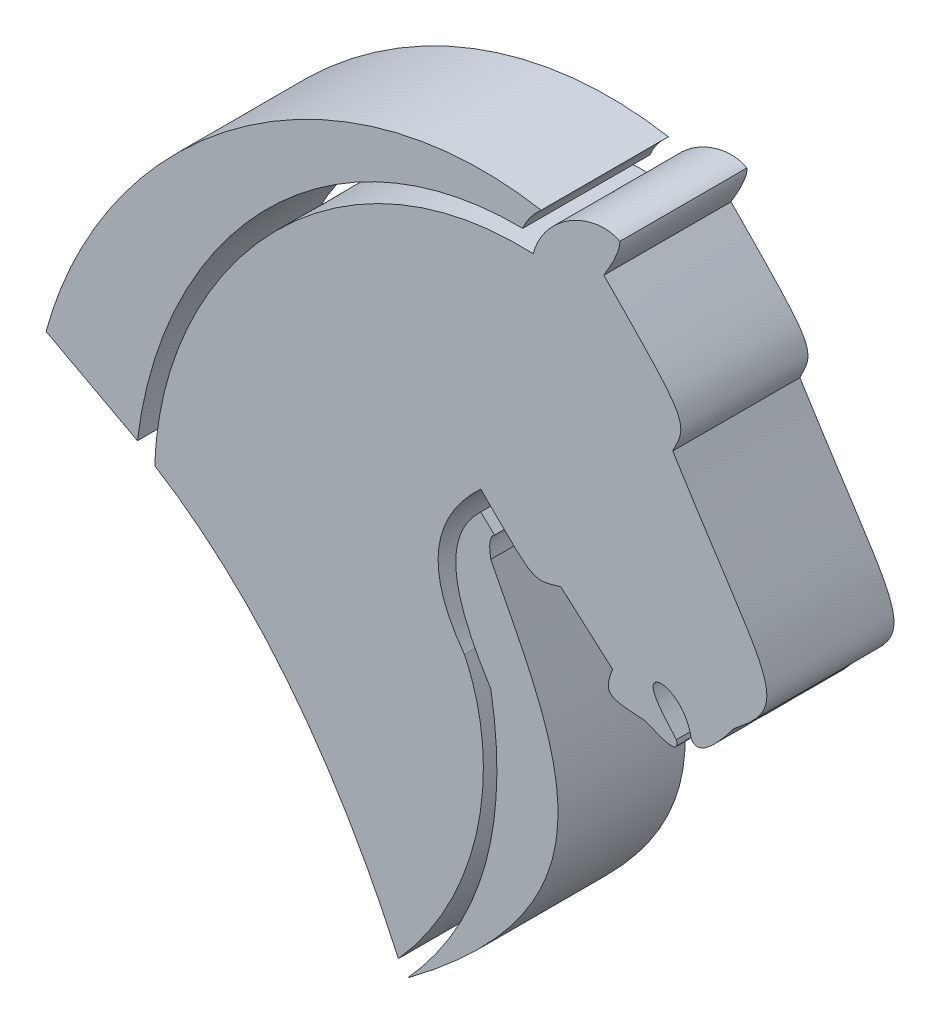
ISO-10303-21;
HEADER;
FILE_DESCRIPTION(('STEP AP214'),'2;1');
FILE_NAME('part.step','',(''),(''),'','','');
FILE_SCHEMA(('AUTOMOTIVE_DESIGN { 1 0 10303 214 1 1 1 1 }'));
ENDSEC;
DATA;
#1=APPLICATION_CONTEXT('core data for automotive mechanical design processes');
#2=APPLICATION_PROTOCOL_DEFINITION('international standard','automotive_design',2000,#1);
#3=PRODUCT_CONTEXT('',#1,'mechanical');
#4=PRODUCT('Part','Part','',(#3));
#5=PRODUCT_RELATED_PRODUCT_CATEGORY('part','',(#4));
#6=PRODUCT_DEFINITION_FORMATION('','',#4);
#7=PRODUCT_DEFINITION_CONTEXT('part definition',#1,'design');
#8=PRODUCT_DEFINITION('design','',#6,#7);
#9=PRODUCT_DEFINITION_SHAPE('','',#8);
#10=(LENGTH_UNIT() NAMED_UNIT(*) SI_UNIT(.MILLI.,.METRE.));
#11=(NAMED_UNIT(*) PLANE_ANGLE_UNIT() SI_UNIT($,.RADIAN.));
#12=(NAMED_UNIT(*) SI_UNIT($,.STERADIAN.) SOLID_ANGLE_UNIT());
#13=UNCERTAINTY_MEASURE_WITH_UNIT(LENGTH_MEASURE(1.E-05),#10,'distance_accuracy_value','');
#14=(GEOMETRIC_REPRESENTATION_CONTEXT(3) GLOBAL_UNCERTAINTY_ASSIGNED_CONTEXT((#13)) GLOBAL_UNIT_ASSIGNED_CONTEXT((#10,
#11,#12)) REPRESENTATION_CONTEXT('',''));
#15=CARTESIAN_POINT('',(0.,0.,0.));
#16=DIRECTION('',(0.,0.,1.));
#17=DIRECTION('',(1.,0.,0.));
#18=AXIS2_PLACEMENT_3D('',#15,#16,#17);
#19=CARTESIAN_POINT('',(5.68786194255588,3.04382337473348,-65.));
#20=DIRECTION('',(-0.688144374233263,-0.725573786882568,0.));
#21=DIRECTION('',(0.725573786882568,-0.688144374233263,0.));
#22=AXIS2_PLACEMENT_3D('',#19,#20,#21);
#23=PLANE('',#22);
#24=CARTESIAN_POINT('',(5.68786194255588,3.04382337473348,-75.));
#25=CARTESIAN_POINT('',(4.59769161722743,4.07775622883235,-75.));
#26=B_SPLINE_CURVE_WITH_KNOTS('',1,(#24,#25),.UNSPECIFIED.,.F.,.F.,(2,2),(0.,1.),.UNSPECIFIED.);
#27=CARTESIAN_POINT('',(5.68786194255588,3.04382337473348,-75.));
#28=VERTEX_POINT('',#27);
#29=CARTESIAN_POINT('',(4.59769161722743,4.07775622883235,-75.));
#30=VERTEX_POINT('',#29);
#31=EDGE_CURVE('E174',#28,#30,#26,.T.);
#32=ORIENTED_EDGE('',*,*,#31,.T.);
#33=DIRECTION('',(0.,0.,-1.));
#34=VECTOR('',#33,1.);
#35=CARTESIAN_POINT('',(4.59769161722743,4.07775622883235,-65.));
#36=LINE('',#35,#34);
#37=CARTESIAN_POINT('',(4.59769161722743,4.07775622883235,-65.));
#38=VERTEX_POINT('',#37);
#39=EDGE_CURVE('E12',#38,#30,#36,.T.);
#40=ORIENTED_EDGE('',*,*,#39,.F.);
#41=CARTESIAN_POINT('',(5.68786194255588,3.04382337473348,-65.));
#42=CARTESIAN_POINT('',(4.59769161722743,4.07775622883235,-65.));
#43=B_SPLINE_CURVE_WITH_KNOTS('',1,(#41,#42),.UNSPECIFIED.,.F.,.F.,(2,2),(0.,1.),.UNSPECIFIED.);
#44=CARTESIAN_POINT('',(5.68786194255588,3.04382337473348,-65.));
#45=VERTEX_POINT('',#44);
#46=EDGE_CURVE('E147',#45,#38,#43,.T.);
#47=ORIENTED_EDGE('',*,*,#46,.F.);
#48=DIRECTION('',(0.,0.,-1.));
#49=VECTOR('',#48,1.);
#50=CARTESIAN_POINT('',(5.68786194255588,3.04382337473348,-65.));
#51=LINE('',#50,#49);
#52=EDGE_CURVE('E118',#45,#28,#51,.T.);
#53=ORIENTED_EDGE('',*,*,#52,.T.);
#54=EDGE_LOOP('',(#32,#40,#47,#53));
#55=FACE_BOUND('',#54,.T.);
#56=ADVANCED_FACE('F48',(#55),#23,.F.);
#57=CARTESIAN_POINT('',(4.59769161722743,4.07775622883235,-65.));
#58=CARTESIAN_POINT('',(1.57536343725325,1.1984607696645,-65.));
#59=CARTESIAN_POINT('',(2.21095693044982,-2.63074780909687,-65.));
#60=CARTESIAN_POINT('',(5.38453361230358,-7.56252350651665,-65.));
#61=B_SPLINE_CURVE_WITH_KNOTS('',3,(#57,#58,#59,#60),.UNSPECIFIED.,.F.,.F.,(4,4),(0.,1.),.UNSPECIFIED.);
#62=DIRECTION('',(0.,0.,-1.));
#63=VECTOR('',#62,1.);
#64=SURFACE_OF_LINEAR_EXTRUSION('',#61,#63);
#65=CARTESIAN_POINT('',(4.59769161722743,4.07775622883235,-75.));
#66=CARTESIAN_POINT('',(1.57536343725325,1.1984607696645,-75.));
#67=CARTESIAN_POINT('',(2.21095693044982,-2.63074780909687,-75.));
#68=CARTESIAN_POINT('',(5.38453361230358,-7.56252350651665,-75.));
#69=B_SPLINE_CURVE_WITH_KNOTS('',3,(#65,#66,#67,#68),.UNSPECIFIED.,.F.,.F.,(4,4),(0.,1.),.UNSPECIFIED.);
#70=CARTESIAN_POINT('',(5.38453361230358,-7.56252350651665,-75.));
#71=VERTEX_POINT('',#70);
#72=EDGE_CURVE('E173',#30,#71,#69,.T.);
#73=ORIENTED_EDGE('',*,*,#72,.T.);
#74=DIRECTION('',(0.,0.,-1.));
#75=VECTOR('',#74,1.);
#76=CARTESIAN_POINT('',(5.38453361230358,-7.56252350651665,-65.));
#77=LINE('',#76,#75);
#78=CARTESIAN_POINT('',(5.38453361230358,-7.56252350651665,-65.));
#79=VERTEX_POINT('',#78);
#80=EDGE_CURVE('E56',#79,#71,#77,.T.);
#81=ORIENTED_EDGE('',*,*,#80,.F.);
#82=EDGE_CURVE('E98',#38,#79,#61,.T.);
#83=ORIENTED_EDGE('',*,*,#82,.F.);
#84=ORIENTED_EDGE('',*,*,#39,.T.);
#85=EDGE_LOOP('',(#73,#81,#83,#84));
#86=FACE_BOUND('',#85,.T.);
#87=ADVANCED_FACE('F141',(#86),#64,.F.);
#88=CARTESIAN_POINT('',(5.38453361230358,-7.56252350651665,-65.));
#89=CARTESIAN_POINT('',(7.71100104688763,-20.7718087710903,-65.));
#90=CARTESIAN_POINT('',(-1.16877961297524,-30.5558514855417,-65.));
#91=B_SPLINE_CURVE_WITH_KNOTS('',2,(#88,#89,#90),.UNSPECIFIED.,.F.,.F.,(3,3),(0.,1.),.UNSPECIFIED.);
#92=DIRECTION('',(0.,0.,-1.));
#93=VECTOR('',#92,1.);
#94=SURFACE_OF_LINEAR_EXTRUSION('',#91,#93);
#95=CARTESIAN_POINT('',(5.38453361230358,-7.56252350651665,-75.));
#96=CARTESIAN_POINT('',(7.71100104688763,-20.7718087710903,-75.));
#97=CARTESIAN_POINT('',(-1.16877961297524,-30.5558514855417,-75.));
#98=B_SPLINE_CURVE_WITH_KNOTS('',2,(#95,#96,#97),.UNSPECIFIED.,.F.,.F.,(3,3),(0.,1.),.UNSPECIFIED.);
#99=CARTESIAN_POINT('',(-1.16877961297524,-30.5558514855417,-75.));
#100=VERTEX_POINT('',#99);
#101=EDGE_CURVE('E113',#71,#100,#98,.T.);
#102=ORIENTED_EDGE('',*,*,#101,.T.);
#103=DIRECTION('',(0.,0.,-1.));
#104=VECTOR('',#103,1.);
#105=CARTESIAN_POINT('',(-1.16877961297524,-30.5558514855417,-65.));
#106=LINE('',#105,#104);
#107=CARTESIAN_POINT('',(-1.16877961297524,-30.5558514855417,-65.));
#108=VERTEX_POINT('',#107);
#109=EDGE_CURVE('E110',#108,#100,#106,.T.);
#110=ORIENTED_EDGE('',*,*,#109,.F.);
#111=EDGE_CURVE('E102',#79,#108,#91,.T.);
#112=ORIENTED_EDGE('',*,*,#111,.F.);
#113=ORIENTED_EDGE('',*,*,#80,.T.);
#114=EDGE_LOOP('',(#102,#110,#112,#113));
#115=FACE_BOUND('',#114,.T.);
#116=ADVANCED_FACE('F111',(#115),#94,.F.);
#117=CARTESIAN_POINT('',(-1.16877961297524,-30.5558514855417,-65.));
#118=CARTESIAN_POINT('',(16.280884402465,-17.4810860835088,-65.));
#119=CARTESIAN_POINT('',(10.776039320597,-9.31651874617872,-65.));
#120=CARTESIAN_POINT('',(5.38453361230358,1.23460683532894,-65.));
#121=B_SPLINE_CURVE_WITH_KNOTS('',3,(#117,#118,#119,#120),.UNSPECIFIED.,.F.,.F.,(4,4),(0.,1.),.UNSPECIFIED.);
#122=DIRECTION('',(0.,0.,-1.));
#123=VECTOR('',#122,1.);
#124=SURFACE_OF_LINEAR_EXTRUSION('',#121,#123);
#125=CARTESIAN_POINT('',(-1.16877961297524,-30.5558514855417,-75.));
#126=CARTESIAN_POINT('',(16.280884402465,-17.4810860835088,-75.));
#127=CARTESIAN_POINT('',(10.776039320597,-9.31651874617872,-75.));
#128=CARTESIAN_POINT('',(5.38453361230358,1.23460683532894,-75.));
#129=B_SPLINE_CURVE_WITH_KNOTS('',3,(#125,#126,#127,#128),.UNSPECIFIED.,.F.,.F.,(4,4),(0.,1.),.UNSPECIFIED.);
#130=CARTESIAN_POINT('',(5.38453361230358,1.23460683532894,-75.));
#131=VERTEX_POINT('',#130);
#132=EDGE_CURVE('E84',#100,#131,#129,.T.);
#133=ORIENTED_EDGE('',*,*,#132,.T.);
#134=DIRECTION('',(0.,0.,-1.));
#135=VECTOR('',#134,1.);
#136=CARTESIAN_POINT('',(5.38453361230358,1.23460683532894,-65.));
#137=LINE('',#136,#135);
#138=CARTESIAN_POINT('',(5.38453361230358,1.23460683532894,-65.));
#139=VERTEX_POINT('',#138);
#140=EDGE_CURVE('E114',#139,#131,#137,.T.);
#141=ORIENTED_EDGE('',*,*,#140,.F.);
#142=EDGE_CURVE('E106',#108,#139,#121,.T.);
#143=ORIENTED_EDGE('',*,*,#142,.F.);
#144=ORIENTED_EDGE('',*,*,#109,.T.);
#145=EDGE_LOOP('',(#133,#141,#143,#144));
#146=FACE_BOUND('',#145,.T.);
#147=ADVANCED_FACE('F116',(#146),#124,.F.);
#148=CARTESIAN_POINT('',(5.38453361230358,1.23460683532894,-65.));
#149=CARTESIAN_POINT('',(5.12442906169839,2.70993722311423,-65.));
#150=CARTESIAN_POINT('',(5.68786194255588,3.04382337473348,-65.));
#151=B_SPLINE_CURVE_WITH_KNOTS('',2,(#148,#149,#150),.UNSPECIFIED.,.F.,.F.,(3,3),(0.,1.),.UNSPECIFIED.);
#152=DIRECTION('',(0.,0.,-1.));
#153=VECTOR('',#152,1.);
#154=SURFACE_OF_LINEAR_EXTRUSION('',#151,#153);
#155=CARTESIAN_POINT('',(5.38453361230358,1.23460683532894,-75.));
#156=CARTESIAN_POINT('',(5.12442906169839,2.70993722311423,-75.));
#157=CARTESIAN_POINT('',(5.68786194255588,3.04382337473348,-75.));
#158=B_SPLINE_CURVE_WITH_KNOTS('',2,(#155,#156,#157),.UNSPECIFIED.,.F.,.F.,(3,3),(0.,1.),.UNSPECIFIED.);
#159=EDGE_CURVE('E90',#131,#28,#158,.T.);
#160=ORIENTED_EDGE('',*,*,#159,.T.);
#161=ORIENTED_EDGE('',*,*,#52,.F.);
#162=EDGE_CURVE('E64',#139,#45,#151,.T.);
#163=ORIENTED_EDGE('',*,*,#162,.F.);
#164=ORIENTED_EDGE('',*,*,#140,.T.);
#165=EDGE_LOOP('',(#160,#161,#163,#164));
#166=FACE_BOUND('',#165,.T.);
#167=ADVANCED_FACE('F138',(#166),#154,.F.);
#168=CARTESIAN_POINT('',(5.33031341956406,2.42457616407272,-65.));
#169=DIRECTION('',(0.,0.,1.));
#170=DIRECTION('',(1.,0.,0.));
#171=AXIS2_PLACEMENT_3D('',#168,#169,#170);
#172=PLANE('',#171);
#173=ORIENTED_EDGE('',*,*,#46,.T.);
#174=ORIENTED_EDGE('',*,*,#82,.T.);
#175=ORIENTED_EDGE('',*,*,#111,.T.);
#176=ORIENTED_EDGE('',*,*,#142,.T.);
#177=ORIENTED_EDGE('',*,*,#162,.T.);
#178=EDGE_LOOP('',(#173,#174,#175,#176,#177));
#179=FACE_BOUND('',#178,.T.);
#180=ADVANCED_FACE('F104',(#179),#172,.T.);
#181=CARTESIAN_POINT('',(5.33031341956406,2.42457616407272,-75.));
#182=DIRECTION('',(0.,0.,1.));
#183=DIRECTION('',(1.,0.,0.));
#184=AXIS2_PLACEMENT_3D('',#181,#182,#183);
#185=PLANE('',#184);
#186=ORIENTED_EDGE('',*,*,#31,.F.);
#187=ORIENTED_EDGE('',*,*,#159,.F.);
#188=ORIENTED_EDGE('',*,*,#132,.F.);
#189=ORIENTED_EDGE('',*,*,#101,.F.);
#190=ORIENTED_EDGE('',*,*,#72,.F.);
#191=EDGE_LOOP('',(#186,#187,#188,#189,#190));
#192=FACE_BOUND('',#191,.T.);
#193=ADVANCED_FACE('F172',(#192),#185,.F.);
#194=CLOSED_SHELL('',(#56,#87,#116,#147,#167,#180,#193));
#195=MANIFOLD_SOLID_BREP('B2',#194);
#196=CARTESIAN_POINT('',(-21.0343584082232,-5.60276640999786,-65.));
#197=CARTESIAN_POINT('',(-9.59892490237231,-12.6721838868266,-65.));
#198=CARTESIAN_POINT('',(-1.87134173877934,-29.5871443506849,-65.));
#199=B_SPLINE_CURVE_WITH_KNOTS('',2,(#196,#197,#198),.UNSPECIFIED.,.F.,.F.,(3,3),(0.,1.),.UNSPECIFIED.);
#200=DIRECTION('',(0.,0.,-1.));
#201=VECTOR('',#200,1.);
#202=SURFACE_OF_LINEAR_EXTRUSION('',#199,#201);
#203=CARTESIAN_POINT('',(-21.0343584082232,-5.60276640999786,-75.));
#204=CARTESIAN_POINT('',(-9.59892490237231,-12.6721838868266,-75.));
#205=CARTESIAN_POINT('',(-1.87134173877934,-29.5871443506849,-75.));
#206=B_SPLINE_CURVE_WITH_KNOTS('',2,(#203,#204,#205),.UNSPECIFIED.,.F.,.F.,(3,3),(0.,1.),.UNSPECIFIED.);
#207=CARTESIAN_POINT('',(-21.0343584082232,-5.60276640999786,-75.));
#208=VERTEX_POINT('',#207);
#209=CARTESIAN_POINT('',(-1.87134173877935,-29.5871443506849,-75.));
#210=VERTEX_POINT('',#209);
#211=EDGE_CURVE('E552',#208,#210,#206,.T.);
#212=ORIENTED_EDGE('',*,*,#211,.T.);
#213=DIRECTION('',(0.,0.,-1.));
#214=VECTOR('',#213,1.);
#215=CARTESIAN_POINT('',(-1.87134173877935,-29.5871443506849,-65.));
#216=LINE('',#215,#214);
#217=CARTESIAN_POINT('',(-1.87134173877935,-29.5871443506849,-65.));
#218=VERTEX_POINT('',#217);
#219=EDGE_CURVE('E46',#218,#210,#216,.T.);
#220=ORIENTED_EDGE('',*,*,#219,.F.);
#221=CARTESIAN_POINT('',(-21.0343584082232,-5.60276640999786,-65.));
#222=VERTEX_POINT('',#221);
#223=EDGE_CURVE('E528',#222,#218,#199,.T.);
#224=ORIENTED_EDGE('',*,*,#223,.F.);
#225=DIRECTION('',(0.,0.,-1.));
#226=VECTOR('',#225,1.);
#227=CARTESIAN_POINT('',(-21.0343584082232,-5.60276640999786,-65.));
#228=LINE('',#227,#226);
#229=EDGE_CURVE('E396',#222,#208,#228,.T.);
#230=ORIENTED_EDGE('',*,*,#229,.T.);
#231=EDGE_LOOP('',(#212,#220,#224,#230));
#232=FACE_BOUND('',#231,.T.);
#233=ADVANCED_FACE('F261',(#232),#202,.F.);
#234=CARTESIAN_POINT('',(-1.87134173877935,-29.5871443506849,-65.));
#235=CARTESIAN_POINT('',(5.14300385402906,-21.7014164534,-65.));
#236=CARTESIAN_POINT('',(6.19059142228839,-12.1629290459269,-65.));
#237=CARTESIAN_POINT('',(3.31027396507693,-6.26912412659171,-65.));
#238=B_SPLINE_CURVE_WITH_KNOTS('',3,(#234,#235,#236,#237),.UNSPECIFIED.,.F.,.F.,(4,4),(0.,1.),.UNSPECIFIED.);
#239=DIRECTION('',(0.,0.,-1.));
#240=VECTOR('',#239,1.);
#241=SURFACE_OF_LINEAR_EXTRUSION('',#238,#240);
#242=CARTESIAN_POINT('',(-1.87134173877935,-29.5871443506849,-75.));
#243=CARTESIAN_POINT('',(5.14300385402906,-21.7014164534,-75.));
#244=CARTESIAN_POINT('',(6.19059142228839,-12.1629290459269,-75.));
#245=CARTESIAN_POINT('',(3.31027396507693,-6.26912412659171,-75.));
#246=B_SPLINE_CURVE_WITH_KNOTS('',3,(#242,#243,#244,#245),.UNSPECIFIED.,.F.,.F.,(4,4),(0.,1.),.UNSPECIFIED.);
#247=CARTESIAN_POINT('',(3.31027396507693,-6.26912412659171,-75.));
#248=VERTEX_POINT('',#247);
#249=EDGE_CURVE('E543',#210,#248,#246,.T.);
#250=ORIENTED_EDGE('',*,*,#249,.T.);
#251=DIRECTION('',(0.,0.,-1.));
#252=VECTOR('',#251,1.);
#253=CARTESIAN_POINT('',(3.31027396507693,-6.26912412659171,-65.));
#254=LINE('',#253,#252);
#255=CARTESIAN_POINT('',(3.31027396507693,-6.26912412659171,-65.));
#256=VERTEX_POINT('',#255);
#257=EDGE_CURVE('E270',#256,#248,#254,.T.);
#258=ORIENTED_EDGE('',*,*,#257,.F.);
#259=EDGE_CURVE('E342',#218,#256,#238,.T.);
#260=ORIENTED_EDGE('',*,*,#259,.F.);
#261=ORIENTED_EDGE('',*,*,#219,.T.);
#262=EDGE_LOOP('',(#250,#258,#260,#261));
#263=FACE_BOUND('',#262,.T.);
#264=ADVANCED_FACE('F535',(#263),#241,.F.);
#265=CARTESIAN_POINT('',(3.31027396507693,-6.26912412659171,-65.));
#266=CARTESIAN_POINT('',(-1.38957969263546,0.0430587974839289,-65.));
#267=CARTESIAN_POINT('',(4.59769161722743,5.6288069611945,-65.));
#268=B_SPLINE_CURVE_WITH_KNOTS('',2,(#265,#266,#267),.UNSPECIFIED.,.F.,.F.,(3,3),(0.,1.),.UNSPECIFIED.);
#269=DIRECTION('',(0.,0.,-1.));
#270=VECTOR('',#269,1.);
#271=SURFACE_OF_LINEAR_EXTRUSION('',#268,#270);
#272=CARTESIAN_POINT('',(3.31027396507693,-6.26912412659171,-75.));
#273=CARTESIAN_POINT('',(-1.38957969263546,0.0430587974839289,-75.));
#274=CARTESIAN_POINT('',(4.59769161722743,5.6288069611945,-75.));
#275=B_SPLINE_CURVE_WITH_KNOTS('',2,(#272,#273,#274),.UNSPECIFIED.,.F.,.F.,(3,3),(0.,1.),.UNSPECIFIED.);
#276=CARTESIAN_POINT('',(4.59769161722743,5.6288069611945,-75.));
#277=VERTEX_POINT('',#276);
#278=EDGE_CURVE('E551',#248,#277,#275,.T.);
#279=ORIENTED_EDGE('',*,*,#278,.T.);
#280=DIRECTION('',(0.,0.,-1.));
#281=VECTOR('',#280,1.);
#282=CARTESIAN_POINT('',(4.59769161722743,5.6288069611945,-65.));
#283=LINE('',#282,#281);
#284=CARTESIAN_POINT('',(4.59769161722743,5.6288069611945,-65.));
#285=VERTEX_POINT('',#284);
#286=EDGE_CURVE('E556',#285,#277,#283,.T.);
#287=ORIENTED_EDGE('',*,*,#286,.F.);
#288=EDGE_CURVE('E514',#256,#285,#268,.T.);
#289=ORIENTED_EDGE('',*,*,#288,.F.);
#290=ORIENTED_EDGE('',*,*,#257,.T.);
#291=EDGE_LOOP('',(#279,#287,#289,#290));
#292=FACE_BOUND('',#291,.T.);
#293=ADVANCED_FACE('F507',(#292),#271,.F.);
#294=CARTESIAN_POINT('',(4.59769161722743,5.6288069611945,-65.));
#295=CARTESIAN_POINT('',(8.80131571596467,1.4774017953609,-65.));
#296=CARTESIAN_POINT('',(8.55880849885991,1.41313649967237,-65.));
#297=CARTESIAN_POINT('',(10.8960851315648,2.12659574089169,-65.));
#298=B_SPLINE_CURVE_WITH_KNOTS('',3,(#294,#295,#296,#297),.UNSPECIFIED.,.F.,.F.,(4,4),(0.,1.),.UNSPECIFIED.);
#299=DIRECTION('',(0.,0.,-1.));
#300=VECTOR('',#299,1.);
#301=SURFACE_OF_LINEAR_EXTRUSION('',#298,#300);
#302=CARTESIAN_POINT('',(4.59769161722743,5.6288069611945,-75.));
#303=CARTESIAN_POINT('',(8.80131571596467,1.4774017953609,-75.));
#304=CARTESIAN_POINT('',(8.55880849885991,1.41313649967237,-75.));
#305=CARTESIAN_POINT('',(10.8960851315648,2.12659574089169,-75.));
#306=B_SPLINE_CURVE_WITH_KNOTS('',3,(#302,#303,#304,#305),.UNSPECIFIED.,.F.,.F.,(4,4),(0.,1.),.UNSPECIFIED.);
#307=CARTESIAN_POINT('',(10.8960851315648,2.12659574089169,-75.));
#308=VERTEX_POINT('',#307);
#309=EDGE_CURVE('E560',#277,#308,#306,.T.);
#310=ORIENTED_EDGE('',*,*,#309,.T.);
#311=DIRECTION('',(0.,0.,-1.));
#312=VECTOR('',#311,1.);
#313=CARTESIAN_POINT('',(10.8960851315648,2.12659574089169,-65.));
#314=LINE('',#313,#312);
#315=CARTESIAN_POINT('',(10.8960851315648,2.12659574089169,-65.));
#316=VERTEX_POINT('',#315);
#317=EDGE_CURVE('E674',#316,#308,#314,.T.);
#318=ORIENTED_EDGE('',*,*,#317,.F.);
#319=EDGE_CURVE('E510',#285,#316,#298,.T.);
#320=ORIENTED_EDGE('',*,*,#319,.F.);
#321=ORIENTED_EDGE('',*,*,#286,.T.);
#322=EDGE_LOOP('',(#310,#318,#320,#321));
#323=FACE_BOUND('',#322,.T.);
#324=ADVANCED_FACE('F503',(#323),#301,.F.);
#325=CARTESIAN_POINT('',(10.8960851315648,2.12659574089169,-65.));
#326=DIRECTION('',(0.66060975570472,0.750729479018741,0.));
#327=DIRECTION('',(-0.750729479018741,0.66060975570472,0.));
#328=AXIS2_PLACEMENT_3D('',#325,#326,#327);
#329=PLANE('',#328);
#330=CARTESIAN_POINT('',(10.8960851315648,2.12659574089169,-75.));
#331=CARTESIAN_POINT('',(14.9642917802182,-1.4532516947465,-75.));
#332=B_SPLINE_CURVE_WITH_KNOTS('',1,(#330,#331),.UNSPECIFIED.,.F.,.F.,(2,2),(0.,1.),.UNSPECIFIED.);
#333=CARTESIAN_POINT('',(14.9642917802182,-1.4532516947465,-75.));
#334=VERTEX_POINT('',#333);
#335=EDGE_CURVE('E562',#308,#334,#332,.T.);
#336=ORIENTED_EDGE('',*,*,#335,.T.);
#337=DIRECTION('',(0.,0.,-1.));
#338=VECTOR('',#337,1.);
#339=CARTESIAN_POINT('',(14.9642917802182,-1.4532516947465,-65.));
#340=LINE('',#339,#338);
#341=CARTESIAN_POINT('',(14.9642917802182,-1.4532516947465,-65.));
#342=VERTEX_POINT('',#341);
#343=EDGE_CURVE('E671',#342,#334,#340,.T.);
#344=ORIENTED_EDGE('',*,*,#343,.F.);
#345=CARTESIAN_POINT('',(10.8960851315648,2.12659574089169,-65.));
#346=CARTESIAN_POINT('',(14.9642917802182,-1.4532516947465,-65.));
#347=B_SPLINE_CURVE_WITH_KNOTS('',1,(#345,#346),.UNSPECIFIED.,.F.,.F.,(2,2),(0.,1.),.UNSPECIFIED.);
#348=EDGE_CURVE('E489',#316,#342,#347,.T.);
#349=ORIENTED_EDGE('',*,*,#348,.F.);
#350=ORIENTED_EDGE('',*,*,#317,.T.);
#351=EDGE_LOOP('',(#336,#344,#349,#350));
#352=FACE_BOUND('',#351,.T.);
#353=ADVANCED_FACE('F499',(#352),#329,.F.);
#354=CARTESIAN_POINT('',(14.9642917802182,-1.4532516947465,-65.));
#355=CARTESIAN_POINT('',(14.1972748291459,-3.40914491998081,-65.));
#356=CARTESIAN_POINT('',(14.6251209823059,-3.53733032024379,-65.));
#357=CARTESIAN_POINT('',(17.5318564531599,-3.67822366623438,-65.));
#358=B_SPLINE_CURVE_WITH_KNOTS('',3,(#354,#355,#356,#357),.UNSPECIFIED.,.F.,.F.,(4,4),(0.,1.),.UNSPECIFIED.);
#359=DIRECTION('',(0.,0.,-1.));
#360=VECTOR('',#359,1.);
#361=SURFACE_OF_LINEAR_EXTRUSION('',#358,#360);
#362=CARTESIAN_POINT('',(14.9642917802182,-1.4532516947465,-75.));
#363=CARTESIAN_POINT('',(14.1972748291459,-3.40914491998081,-75.));
#364=CARTESIAN_POINT('',(14.6251209823059,-3.53733032024379,-75.));
#365=CARTESIAN_POINT('',(17.5318564531599,-3.67822366623438,-75.));
#366=B_SPLINE_CURVE_WITH_KNOTS('',3,(#362,#363,#364,#365),.UNSPECIFIED.,.F.,.F.,(4,4),(0.,1.),.UNSPECIFIED.);
#367=CARTESIAN_POINT('',(17.5318564531599,-3.67822366623438,-75.));
#368=VERTEX_POINT('',#367);
#369=EDGE_CURVE('E580',#334,#368,#366,.T.);
#370=ORIENTED_EDGE('',*,*,#369,.T.);
#371=DIRECTION('',(0.,0.,-1.));
#372=VECTOR('',#371,1.);
#373=CARTESIAN_POINT('',(17.5318564531599,-3.67822366623438,-65.));
#374=LINE('',#373,#372);
#375=CARTESIAN_POINT('',(17.5318564531599,-3.67822366623438,-65.));
#376=VERTEX_POINT('',#375);
#377=EDGE_CURVE('E668',#376,#368,#374,.T.);
#378=ORIENTED_EDGE('',*,*,#377,.F.);
#379=EDGE_CURVE('E481',#342,#376,#358,.T.);
#380=ORIENTED_EDGE('',*,*,#379,.F.);
#381=ORIENTED_EDGE('',*,*,#343,.T.);
#382=EDGE_LOOP('',(#370,#378,#380,#381));
#383=FACE_BOUND('',#382,.T.);
#384=ADVANCED_FACE('F496',(#383),#361,.F.);
#385=CARTESIAN_POINT('',(17.5318564531599,-3.67822366623438,-65.));
#386=CARTESIAN_POINT('',(20.380619427895,-4.99276404244267,-65.));
#387=CARTESIAN_POINT('',(19.9893919255559,-3.74083603495785,-65.));
#388=B_SPLINE_CURVE_WITH_KNOTS('',2,(#385,#386,#387),.UNSPECIFIED.,.F.,.F.,(3,3),(0.,1.),.UNSPECIFIED.);
#389=DIRECTION('',(0.,0.,-1.));
#390=VECTOR('',#389,1.);
#391=SURFACE_OF_LINEAR_EXTRUSION('',#388,#390);
#392=CARTESIAN_POINT('',(17.5318564531599,-3.67822366623438,-75.));
#393=CARTESIAN_POINT('',(20.380619427895,-4.99276404244267,-75.));
#394=CARTESIAN_POINT('',(19.9893919255559,-3.74083603495785,-75.));
#395=B_SPLINE_CURVE_WITH_KNOTS('',2,(#392,#393,#394),.UNSPECIFIED.,.F.,.F.,(3,3),(0.,1.),.UNSPECIFIED.);
#396=CARTESIAN_POINT('',(19.9893919255559,-3.74083603495785,-75.));
#397=VERTEX_POINT('',#396);
#398=EDGE_CURVE('E587',#368,#397,#395,.T.);
#399=ORIENTED_EDGE('',*,*,#398,.T.);
#400=DIRECTION('',(0.,0.,-1.));
#401=VECTOR('',#400,1.);
#402=CARTESIAN_POINT('',(19.9893919255559,-3.74083603495785,-65.));
#403=LINE('',#402,#401);
#404=CARTESIAN_POINT('',(19.9893919255559,-3.74083603495785,-65.));
#405=VERTEX_POINT('',#404);
#406=EDGE_CURVE('E665',#405,#397,#403,.T.);
#407=ORIENTED_EDGE('',*,*,#406,.F.);
#408=EDGE_CURVE('E473',#376,#405,#388,.T.);
#409=ORIENTED_EDGE('',*,*,#408,.F.);
#410=ORIENTED_EDGE('',*,*,#377,.T.);
#411=EDGE_LOOP('',(#399,#407,#409,#410));
#412=FACE_BOUND('',#411,.T.);
#413=ADVANCED_FACE('F465',(#412),#391,.F.);
#414=CARTESIAN_POINT('',(19.9893919255559,-3.74083603495785,-65.));
#415=CARTESIAN_POINT('',(18.9328245284221,-2.56687226036467,-65.));
#416=CARTESIAN_POINT('',(17.5866680196214,-1.07979565345136,-65.));
#417=CARTESIAN_POINT('',(18.4084296152885,-0.610217598784524,-65.));
#418=B_SPLINE_CURVE_WITH_KNOTS('',3,(#414,#415,#416,#417),.UNSPECIFIED.,.F.,.F.,(4,4),(0.,1.),.UNSPECIFIED.);
#419=DIRECTION('',(0.,0.,-1.));
#420=VECTOR('',#419,1.);
#421=SURFACE_OF_LINEAR_EXTRUSION('',#418,#420);
#422=CARTESIAN_POINT('',(19.9893919255559,-3.74083603495785,-75.));
#423=CARTESIAN_POINT('',(18.9328245284221,-2.56687226036467,-75.));
#424=CARTESIAN_POINT('',(17.5866680196214,-1.07979565345136,-75.));
#425=CARTESIAN_POINT('',(18.4084296152885,-0.610217598784524,-75.));
#426=B_SPLINE_CURVE_WITH_KNOTS('',3,(#422,#423,#424,#425),.UNSPECIFIED.,.F.,.F.,(4,4),(0.,1.),.UNSPECIFIED.);
#427=CARTESIAN_POINT('',(18.4084296152885,-0.610217598784524,-75.));
#428=VERTEX_POINT('',#427);
#429=EDGE_CURVE('E594',#397,#428,#426,.T.);
#430=ORIENTED_EDGE('',*,*,#429,.T.);
#431=DIRECTION('',(0.,0.,-1.));
#432=VECTOR('',#431,1.);
#433=CARTESIAN_POINT('',(18.4084296152885,-0.610217598784524,-65.));
#434=LINE('',#433,#432);
#435=CARTESIAN_POINT('',(18.4084296152885,-0.610217598784524,-65.));
#436=VERTEX_POINT('',#435);
#437=EDGE_CURVE('E662',#436,#428,#434,.T.);
#438=ORIENTED_EDGE('',*,*,#437,.F.);
#439=EDGE_CURVE('E469',#405,#436,#418,.T.);
#440=ORIENTED_EDGE('',*,*,#439,.F.);
#441=ORIENTED_EDGE('',*,*,#406,.T.);
#442=EDGE_LOOP('',(#430,#438,#440,#441));
#443=FACE_BOUND('',#442,.T.);
#444=ADVANCED_FACE('F461',(#443),#421,.F.);
#445=CARTESIAN_POINT('',(18.4084296152885,-0.610217598784524,-65.));
#446=CARTESIAN_POINT('',(19.3083391691485,-0.179826073025401,-65.));
#447=CARTESIAN_POINT('',(20.8962855352279,-1.38974694171222,-65.));
#448=CARTESIAN_POINT('',(21.1261523717947,-3.01768918496028,-65.));
#449=B_SPLINE_CURVE_WITH_KNOTS('',3,(#445,#446,#447,#448),.UNSPECIFIED.,.F.,.F.,(4,4),(0.,1.),.UNSPECIFIED.);
#450=DIRECTION('',(0.,0.,-1.));
#451=VECTOR('',#450,1.);
#452=SURFACE_OF_LINEAR_EXTRUSION('',#449,#451);
#453=CARTESIAN_POINT('',(18.4084296152885,-0.610217598784524,-75.));
#454=CARTESIAN_POINT('',(19.3083391691485,-0.179826073025401,-75.));
#455=CARTESIAN_POINT('',(20.8962855352279,-1.38974694171222,-75.));
#456=CARTESIAN_POINT('',(21.1261523717947,-3.01768918496028,-75.));
#457=B_SPLINE_CURVE_WITH_KNOTS('',3,(#453,#454,#455,#456),.UNSPECIFIED.,.F.,.F.,(4,4),(0.,1.),.UNSPECIFIED.);
#458=CARTESIAN_POINT('',(21.1261523717947,-3.01768918496028,-75.));
#459=VERTEX_POINT('',#458);
#460=EDGE_CURVE('E601',#428,#459,#457,.T.);
#461=ORIENTED_EDGE('',*,*,#460,.T.);
#462=DIRECTION('',(0.,0.,-1.));
#463=VECTOR('',#462,1.);
#464=CARTESIAN_POINT('',(21.1261523717947,-3.01768918496028,-65.));
#465=LINE('',#464,#463);
#466=CARTESIAN_POINT('',(21.1261523717947,-3.01768918496028,-65.));
#467=VERTEX_POINT('',#466);
#468=EDGE_CURVE('E659',#467,#459,#465,.T.);
#469=ORIENTED_EDGE('',*,*,#468,.F.);
#470=EDGE_CURVE('E446',#436,#467,#449,.T.);
#471=ORIENTED_EDGE('',*,*,#470,.F.);
#472=ORIENTED_EDGE('',*,*,#437,.T.);
#473=EDGE_LOOP('',(#461,#469,#471,#472));
#474=FACE_BOUND('',#473,.T.);
#475=ADVANCED_FACE('F457',(#474),#452,.F.);
#476=CARTESIAN_POINT('',(21.1261523717947,-3.01768918496028,-65.));
#477=CARTESIAN_POINT('',(21.7534120827551,-4.39735456516194,-65.));
#478=CARTESIAN_POINT('',(24.5166359284017,-0.723386188697561,-65.));
#479=B_SPLINE_CURVE_WITH_KNOTS('',2,(#476,#477,#478),.UNSPECIFIED.,.F.,.F.,(3,3),(0.,1.),.UNSPECIFIED.);
#480=DIRECTION('',(0.,0.,-1.));
#481=VECTOR('',#480,1.);
#482=SURFACE_OF_LINEAR_EXTRUSION('',#479,#481);
#483=CARTESIAN_POINT('',(21.1261523717947,-3.01768918496028,-75.));
#484=CARTESIAN_POINT('',(21.7534120827551,-4.39735456516194,-75.));
#485=CARTESIAN_POINT('',(24.5166359284017,-0.723386188697561,-75.));
#486=B_SPLINE_CURVE_WITH_KNOTS('',2,(#483,#484,#485),.UNSPECIFIED.,.F.,.F.,(3,3),(0.,1.),.UNSPECIFIED.);
#487=CARTESIAN_POINT('',(24.5166359284017,-0.723386188697561,-75.));
#488=VERTEX_POINT('',#487);
#489=EDGE_CURVE('E608',#459,#488,#486,.T.);
#490=ORIENTED_EDGE('',*,*,#489,.T.);
#491=DIRECTION('',(0.,0.,-1.));
#492=VECTOR('',#491,1.);
#493=CARTESIAN_POINT('',(24.5166359284017,-0.723386188697561,-65.));
#494=LINE('',#493,#492);
#495=CARTESIAN_POINT('',(24.5166359284017,-0.723386188697561,-65.));
#496=VERTEX_POINT('',#495);
#497=EDGE_CURVE('E656',#496,#488,#494,.T.);
#498=ORIENTED_EDGE('',*,*,#497,.F.);
#499=EDGE_CURVE('E438',#467,#496,#479,.T.);
#500=ORIENTED_EDGE('',*,*,#499,.F.);
#501=ORIENTED_EDGE('',*,*,#468,.T.);
#502=EDGE_LOOP('',(#490,#498,#500,#501));
#503=FACE_BOUND('',#502,.T.);
#504=ADVANCED_FACE('F454',(#503),#482,.F.);
#505=CARTESIAN_POINT('',(24.5166359284017,-0.723386188697561,-65.));
#506=CARTESIAN_POINT('',(29.3878392615222,3.06660695338063,-65.));
#507=CARTESIAN_POINT('',(27.141695791931,3.67916448194667,-65.));
#508=CARTESIAN_POINT('',(19.7002604549267,15.7778540840893,-65.));
#509=B_SPLINE_CURVE_WITH_KNOTS('',3,(#505,#506,#507,#508),.UNSPECIFIED.,.F.,.F.,(4,4),(0.,1.),.UNSPECIFIED.);
#510=DIRECTION('',(0.,0.,-1.));
#511=VECTOR('',#510,1.);
#512=SURFACE_OF_LINEAR_EXTRUSION('',#509,#511);
#513=CARTESIAN_POINT('',(24.5166359284017,-0.723386188697561,-75.));
#514=CARTESIAN_POINT('',(29.3878392615222,3.06660695338063,-75.));
#515=CARTESIAN_POINT('',(27.141695791931,3.67916448194667,-75.));
#516=CARTESIAN_POINT('',(19.7002604549267,15.7778540840893,-75.));
#517=B_SPLINE_CURVE_WITH_KNOTS('',3,(#513,#514,#515,#516),.UNSPECIFIED.,.F.,.F.,(4,4),(0.,1.),.UNSPECIFIED.);
#518=CARTESIAN_POINT('',(19.7002604549267,15.7778540840893,-75.));
#519=VERTEX_POINT('',#518);
#520=EDGE_CURVE('E615',#488,#519,#517,.T.);
#521=ORIENTED_EDGE('',*,*,#520,.T.);
#522=DIRECTION('',(0.,0.,-1.));
#523=VECTOR('',#522,1.);
#524=CARTESIAN_POINT('',(19.7002604549267,15.7778540840893,-65.));
#525=LINE('',#524,#523);
#526=CARTESIAN_POINT('',(19.7002604549267,15.7778540840893,-65.));
#527=VERTEX_POINT('',#526);
#528=EDGE_CURVE('E653',#527,#519,#525,.T.);
#529=ORIENTED_EDGE('',*,*,#528,.F.);
#530=EDGE_CURVE('E430',#496,#527,#509,.T.);
#531=ORIENTED_EDGE('',*,*,#530,.F.);
#532=ORIENTED_EDGE('',*,*,#497,.T.);
#533=EDGE_LOOP('',(#521,#529,#531,#532));
#534=FACE_BOUND('',#533,.T.);
#535=ADVANCED_FACE('F423',(#534),#512,.F.);
#536=CARTESIAN_POINT('',(19.7002604549267,15.7778540840893,-65.));
#537=CARTESIAN_POINT('',(21.000842635132,18.2444754603407,-65.));
#538=CARTESIAN_POINT('',(20.7856294099226,18.3949039266037,-65.));
#539=CARTESIAN_POINT('',(14.2824112504727,25.0431655062389,-65.));
#540=B_SPLINE_CURVE_WITH_KNOTS('',3,(#536,#537,#538,#539),.UNSPECIFIED.,.F.,.F.,(4,4),(0.,1.),.UNSPECIFIED.);
#541=DIRECTION('',(0.,0.,-1.));
#542=VECTOR('',#541,1.);
#543=SURFACE_OF_LINEAR_EXTRUSION('',#540,#542);
#544=CARTESIAN_POINT('',(19.7002604549267,15.7778540840893,-75.));
#545=CARTESIAN_POINT('',(21.000842635132,18.2444754603407,-75.));
#546=CARTESIAN_POINT('',(20.7856294099226,18.3949039266037,-75.));
#547=CARTESIAN_POINT('',(14.2824112504727,25.0431655062389,-75.));
#548=B_SPLINE_CURVE_WITH_KNOTS('',3,(#544,#545,#546,#547),.UNSPECIFIED.,.F.,.F.,(4,4),(0.,1.),.UNSPECIFIED.);
#549=CARTESIAN_POINT('',(14.2824112504727,25.0431655062389,-75.));
#550=VERTEX_POINT('',#549);
#551=EDGE_CURVE('E622',#519,#550,#548,.T.);
#552=ORIENTED_EDGE('',*,*,#551,.T.);
#553=DIRECTION('',(0.,0.,-1.));
#554=VECTOR('',#553,1.);
#555=CARTESIAN_POINT('',(14.2824112504727,25.0431655062389,-65.));
#556=LINE('',#555,#554);
#557=CARTESIAN_POINT('',(14.2824112504727,25.0431655062389,-65.));
#558=VERTEX_POINT('',#557);
#559=EDGE_CURVE('E391',#558,#550,#556,.T.);
#560=ORIENTED_EDGE('',*,*,#559,.F.);
#561=EDGE_CURVE('E382',#527,#558,#540,.T.);
#562=ORIENTED_EDGE('',*,*,#561,.F.);
#563=ORIENTED_EDGE('',*,*,#528,.T.);
#564=EDGE_LOOP('',(#552,#560,#562,#563));
#565=FACE_BOUND('',#564,.T.);
#566=ADVANCED_FACE('F420',(#565),#543,.F.);
#567=CARTESIAN_POINT('',(14.2824112504727,25.0431655062389,-65.));
#568=CARTESIAN_POINT('',(15.6026669551108,27.2120571658754,-65.));
#569=CARTESIAN_POINT('',(15.5310235753151,27.9716012351916,-65.));
#570=B_SPLINE_CURVE_WITH_KNOTS('',2,(#567,#568,#569),.UNSPECIFIED.,.F.,.F.,(3,3),(0.,1.),.UNSPECIFIED.);
#571=DIRECTION('',(0.,0.,-1.));
#572=VECTOR('',#571,1.);
#573=SURFACE_OF_LINEAR_EXTRUSION('',#570,#572);
#574=CARTESIAN_POINT('',(14.2824112504727,25.0431655062389,-75.));
#575=CARTESIAN_POINT('',(15.6026669551108,27.2120571658754,-75.));
#576=CARTESIAN_POINT('',(15.5310235753151,27.9716012351916,-75.));
#577=B_SPLINE_CURVE_WITH_KNOTS('',2,(#574,#575,#576),.UNSPECIFIED.,.F.,.F.,(3,3),(0.,1.),.UNSPECIFIED.);
#578=CARTESIAN_POINT('',(15.5310235753151,27.9716012351916,-75.));
#579=VERTEX_POINT('',#578);
#580=EDGE_CURVE('E390',#550,#579,#577,.T.);
#581=ORIENTED_EDGE('',*,*,#580,.T.);
#582=DIRECTION('',(0.,0.,-1.));
#583=VECTOR('',#582,1.);
#584=CARTESIAN_POINT('',(15.5310235753151,27.9716012351916,-65.));
#585=LINE('',#584,#583);
#586=CARTESIAN_POINT('',(15.5310235753151,27.9716012351916,-65.));
#587=VERTEX_POINT('',#586);
#588=EDGE_CURVE('E387',#587,#579,#585,.T.);
#589=ORIENTED_EDGE('',*,*,#588,.F.);
#590=EDGE_CURVE('E376',#558,#587,#570,.T.);
#591=ORIENTED_EDGE('',*,*,#590,.F.);
#592=ORIENTED_EDGE('',*,*,#559,.T.);
#593=EDGE_LOOP('',(#581,#589,#591,#592));
#594=FACE_BOUND('',#593,.T.);
#595=ADVANCED_FACE('F388',(#594),#573,.F.);
#596=CARTESIAN_POINT('',(15.5310235753151,27.9716012351916,-65.));
#597=CARTESIAN_POINT('',(13.7156899017441,29.0120973651652,-65.));
#598=CARTESIAN_POINT('',(9.66306193998356,27.1728018946441,-65.));
#599=CARTESIAN_POINT('',(8.71733545701632,23.7280959946195,-65.));
#600=B_SPLINE_CURVE_WITH_KNOTS('',3,(#596,#597,#598,#599),.UNSPECIFIED.,.F.,.F.,(4,4),(0.,1.),.UNSPECIFIED.);
#601=DIRECTION('',(0.,0.,-1.));
#602=VECTOR('',#601,1.);
#603=SURFACE_OF_LINEAR_EXTRUSION('',#600,#602);
#604=CARTESIAN_POINT('',(15.5310235753151,27.9716012351916,-75.));
#605=CARTESIAN_POINT('',(13.7156899017441,29.0120973651652,-75.));
#606=CARTESIAN_POINT('',(9.66306193998356,27.1728018946441,-75.));
#607=CARTESIAN_POINT('',(8.71733545701632,23.7280959946195,-75.));
#608=B_SPLINE_CURVE_WITH_KNOTS('',3,(#604,#605,#606,#607),.UNSPECIFIED.,.F.,.F.,(4,4),(0.,1.),.UNSPECIFIED.);
#609=CARTESIAN_POINT('',(8.71733545701634,23.7280959946195,-75.));
#610=VERTEX_POINT('',#609);
#611=EDGE_CURVE('E328',#579,#610,#608,.T.);
#612=ORIENTED_EDGE('',*,*,#611,.T.);
#613=DIRECTION('',(0.,0.,-1.));
#614=VECTOR('',#613,1.);
#615=CARTESIAN_POINT('',(8.71733545701634,23.7280959946195,-65.));
#616=LINE('',#615,#614);
#617=CARTESIAN_POINT('',(8.71733545701634,23.7280959946195,-65.));
#618=VERTEX_POINT('',#617);
#619=EDGE_CURVE('E392',#618,#610,#616,.T.);
#620=ORIENTED_EDGE('',*,*,#619,.F.);
#621=EDGE_CURVE('E380',#587,#618,#600,.T.);
#622=ORIENTED_EDGE('',*,*,#621,.F.);
#623=ORIENTED_EDGE('',*,*,#588,.T.);
#624=EDGE_LOOP('',(#612,#620,#622,#623));
#625=FACE_BOUND('',#624,.T.);
#626=ADVANCED_FACE('F394',(#625),#603,.F.);
#627=CARTESIAN_POINT('',(8.71733545701634,23.7280959946195,-65.));
#628=CARTESIAN_POINT('',(-7.29098602833585,24.4777513730389,-65.));
#629=CARTESIAN_POINT('',(-20.6585810620189,8.55346448947935,-65.));
#630=CARTESIAN_POINT('',(-21.0343584082232,-5.60276640999786,-65.));
#631=B_SPLINE_CURVE_WITH_KNOTS('',3,(#627,#628,#629,#630),.UNSPECIFIED.,.F.,.F.,(4,4),(0.,1.),.UNSPECIFIED.);
#632=DIRECTION('',(0.,0.,-1.));
#633=VECTOR('',#632,1.);
#634=SURFACE_OF_LINEAR_EXTRUSION('',#631,#633);
#635=CARTESIAN_POINT('',(8.71733545701634,23.7280959946195,-75.));
#636=CARTESIAN_POINT('',(-7.29098602833585,24.4777513730389,-75.));
#637=CARTESIAN_POINT('',(-20.6585810620189,8.55346448947935,-75.));
#638=CARTESIAN_POINT('',(-21.0343584082232,-5.60276640999786,-75.));
#639=B_SPLINE_CURVE_WITH_KNOTS('',3,(#635,#636,#637,#638),.UNSPECIFIED.,.F.,.F.,(4,4),(0.,1.),.UNSPECIFIED.);
#640=EDGE_CURVE('E334',#610,#208,#639,.T.);
#641=ORIENTED_EDGE('',*,*,#640,.T.);
#642=ORIENTED_EDGE('',*,*,#229,.F.);
#643=EDGE_CURVE('E278',#618,#222,#631,.T.);
#644=ORIENTED_EDGE('',*,*,#643,.F.);
#645=ORIENTED_EDGE('',*,*,#619,.T.);
#646=EDGE_LOOP('',(#641,#642,#644,#645));
#647=FACE_BOUND('',#646,.T.);
#648=ADVANCED_FACE('F416',(#647),#634,.F.);
#649=CARTESIAN_POINT('',(-10.5258874879368,-15.133569633584,-65.));
#650=DIRECTION('',(0.,0.,1.));
#651=DIRECTION('',(1.,0.,0.));
#652=AXIS2_PLACEMENT_3D('',#649,#650,#651);
#653=PLANE('',#652);
#654=ORIENTED_EDGE('',*,*,#223,.T.);
#655=ORIENTED_EDGE('',*,*,#259,.T.);
#656=ORIENTED_EDGE('',*,*,#288,.T.);
#657=ORIENTED_EDGE('',*,*,#319,.T.);
#658=ORIENTED_EDGE('',*,*,#348,.T.);
#659=ORIENTED_EDGE('',*,*,#379,.T.);
#660=ORIENTED_EDGE('',*,*,#408,.T.);
#661=ORIENTED_EDGE('',*,*,#439,.T.);
#662=ORIENTED_EDGE('',*,*,#470,.T.);
#663=ORIENTED_EDGE('',*,*,#499,.T.);
#664=ORIENTED_EDGE('',*,*,#530,.T.);
#665=ORIENTED_EDGE('',*,*,#561,.T.);
#666=ORIENTED_EDGE('',*,*,#590,.T.);
#667=ORIENTED_EDGE('',*,*,#621,.T.);
#668=ORIENTED_EDGE('',*,*,#643,.T.);
#669=EDGE_LOOP('',(#654,#655,#656,#657,#658,#659,#660,#661,#662,#663,#664,#665,#666,#667,#668));
#670=FACE_BOUND('',#669,.T.);
#671=ADVANCED_FACE('F378',(#670),#653,.T.);
#672=CARTESIAN_POINT('',(-10.5258874879368,-15.133569633584,-75.));
#673=DIRECTION('',(0.,0.,1.));
#674=DIRECTION('',(1.,0.,0.));
#675=AXIS2_PLACEMENT_3D('',#672,#673,#674);
#676=PLANE('',#675);
#677=ORIENTED_EDGE('',*,*,#211,.F.);
#678=ORIENTED_EDGE('',*,*,#640,.F.);
#679=ORIENTED_EDGE('',*,*,#611,.F.);
#680=ORIENTED_EDGE('',*,*,#580,.F.);
#681=ORIENTED_EDGE('',*,*,#551,.F.);
#682=ORIENTED_EDGE('',*,*,#520,.F.);
#683=ORIENTED_EDGE('',*,*,#489,.F.);
#684=ORIENTED_EDGE('',*,*,#460,.F.);
#685=ORIENTED_EDGE('',*,*,#429,.F.);
#686=ORIENTED_EDGE('',*,*,#398,.F.);
#687=ORIENTED_EDGE('',*,*,#369,.F.);
#688=ORIENTED_EDGE('',*,*,#335,.F.);
#689=ORIENTED_EDGE('',*,*,#309,.F.);
#690=ORIENTED_EDGE('',*,*,#278,.F.);
#691=ORIENTED_EDGE('',*,*,#249,.F.);
#692=EDGE_LOOP('',(#677,#678,#679,#680,#681,#682,#683,#684,#685,#686,#687,#688,#689,#690,#691));
#693=FACE_BOUND('',#692,.T.);
#694=ADVANCED_FACE('F558',(#693),#676,.F.);
#695=CLOSED_SHELL('',(#233,#264,#293,#324,#353,#384,#413,#444,#475,#504,#535,#566,#595,#626,
#648,#671,#694));
#696=MANIFOLD_SOLID_BREP('B6',#695);
#697=CARTESIAN_POINT('',(7.8995102724696,25.0431655062389,-65.));
#698=CARTESIAN_POINT('',(8.33750771291589,26.1175502598641,-65.));
#699=CARTESIAN_POINT('',(9.35476402268198,27.0120382271145,-65.));
#700=B_SPLINE_CURVE_WITH_KNOTS('',2,(#697,#698,#699),.UNSPECIFIED.,.F.,.F.,(3,3),(0.,1.),.UNSPECIFIED.);
#701=DIRECTION('',(0.,0.,-1.));
#702=VECTOR('',#701,1.);
#703=SURFACE_OF_LINEAR_EXTRUSION('',#700,#702);
#704=CARTESIAN_POINT('',(7.8995102724696,25.0431655062389,-75.));
#705=CARTESIAN_POINT('',(8.33750771291589,26.1175502598641,-75.));
#706=CARTESIAN_POINT('',(9.35476402268198,27.0120382271145,-75.));
#707=B_SPLINE_CURVE_WITH_KNOTS('',2,(#704,#705,#706),.UNSPECIFIED.,.F.,.F.,(3,3),(0.,1.),.UNSPECIFIED.);
#708=CARTESIAN_POINT('',(7.8995102724696,25.0431655062389,-75.));
#709=VERTEX_POINT('',#708);
#710=CARTESIAN_POINT('',(9.35476402268198,27.0120382271145,-75.));
#711=VERTEX_POINT('',#710);
#712=EDGE_CURVE('E909',#709,#711,#707,.T.);
#713=ORIENTED_EDGE('',*,*,#712,.T.);
#714=DIRECTION('',(0.,0.,-1.));
#715=VECTOR('',#714,1.);
#716=CARTESIAN_POINT('',(9.35476402268198,27.0120382271145,-65.));
#717=LINE('',#716,#715);
#718=CARTESIAN_POINT('',(9.35476402268198,27.0120382271145,-65.));
#719=VERTEX_POINT('',#718);
#720=EDGE_CURVE('E259',#719,#711,#717,.T.);
#721=ORIENTED_EDGE('',*,*,#720,.F.);
#722=CARTESIAN_POINT('',(7.8995102724696,25.0431655062389,-65.));
#723=VERTEX_POINT('',#722);
#724=EDGE_CURVE('E887',#723,#719,#700,.T.);
#725=ORIENTED_EDGE('',*,*,#724,.F.);
#726=DIRECTION('',(0.,0.,-1.));
#727=VECTOR('',#726,1.);
#728=CARTESIAN_POINT('',(7.8995102724696,25.0431655062389,-65.));
#729=LINE('',#728,#727);
#730=EDGE_CURVE('E895',#723,#709,#729,.T.);
#731=ORIENTED_EDGE('',*,*,#730,.T.);
#732=EDGE_LOOP('',(#713,#721,#725,#731));
#733=FACE_BOUND('',#732,.T.);
#734=ADVANCED_FACE('F835',(#733),#703,.F.);
#735=CARTESIAN_POINT('',(9.35476402268198,27.0120382271145,-65.));
#736=CARTESIAN_POINT('',(-7.65854851585068,30.0080932653467,-65.));
#737=CARTESIAN_POINT('',(-25.1005113281784,15.7552124231056,-65.));
#738=CARTESIAN_POINT('',(-29.5946745859429,-0.723386188697561,-65.));
#739=B_SPLINE_CURVE_WITH_KNOTS('',3,(#735,#736,#737,#738),.UNSPECIFIED.,.F.,.F.,(4,4),(0.,1.),.UNSPECIFIED.);
#740=DIRECTION('',(0.,0.,-1.));
#741=VECTOR('',#740,1.);
#742=SURFACE_OF_LINEAR_EXTRUSION('',#739,#741);
#743=CARTESIAN_POINT('',(9.35476402268198,27.0120382271145,-75.));
#744=CARTESIAN_POINT('',(-7.65854851585068,30.0080932653467,-75.));
#745=CARTESIAN_POINT('',(-25.1005113281784,15.7552124231056,-75.));
#746=CARTESIAN_POINT('',(-29.5946745859429,-0.723386188697561,-75.));
#747=B_SPLINE_CURVE_WITH_KNOTS('',3,(#743,#744,#745,#746),.UNSPECIFIED.,.F.,.F.,(4,4),(0.,1.),.UNSPECIFIED.);
#748=CARTESIAN_POINT('',(-29.5946745859429,-0.723386188697561,-75.));
#749=VERTEX_POINT('',#748);
#750=EDGE_CURVE('E891',#711,#749,#747,.T.);
#751=ORIENTED_EDGE('',*,*,#750,.T.);
#752=DIRECTION('',(0.,0.,-1.));
#753=VECTOR('',#752,1.);
#754=CARTESIAN_POINT('',(-29.5946745859429,-0.723386188697561,-65.));
#755=LINE('',#754,#753);
#756=CARTESIAN_POINT('',(-29.5946745859429,-0.723386188697561,-65.));
#757=VERTEX_POINT('',#756);
#758=EDGE_CURVE('E844',#757,#749,#755,.T.);
#759=ORIENTED_EDGE('',*,*,#758,.F.);
#760=EDGE_CURVE('E882',#719,#757,#739,.T.);
#761=ORIENTED_EDGE('',*,*,#760,.F.);
#762=ORIENTED_EDGE('',*,*,#720,.T.);
#763=EDGE_LOOP('',(#751,#759,#761,#762));
#764=FACE_BOUND('',#763,.T.);
#765=ADVANCED_FACE('F890',(#764),#742,.F.);
#766=CARTESIAN_POINT('',(-29.5946745859429,-0.723386188697561,-65.));
#767=DIRECTION('',(0.472221412515424,0.88147997002878,0.));
#768=DIRECTION('',(-0.88147997002878,0.472221412515424,0.));
#769=AXIS2_PLACEMENT_3D('',#766,#767,#768);
#770=PLANE('',#769);
#771=CARTESIAN_POINT('',(-29.5946745859429,-0.723386188697561,-75.));
#772=CARTESIAN_POINT('',(-22.4040089966584,-4.57552846867149,-75.));
#773=B_SPLINE_CURVE_WITH_KNOTS('',1,(#771,#772),.UNSPECIFIED.,.F.,.F.,(2,2),(0.,1.),.UNSPECIFIED.);
#774=CARTESIAN_POINT('',(-22.4040089966584,-4.5755284686715,-75.));
#775=VERTEX_POINT('',#774);
#776=EDGE_CURVE('E869',#749,#775,#773,.T.);
#777=ORIENTED_EDGE('',*,*,#776,.T.);
#778=DIRECTION('',(0.,0.,-1.));
#779=VECTOR('',#778,1.);
#780=CARTESIAN_POINT('',(-22.4040089966584,-4.5755284686715,-65.));
#781=LINE('',#780,#779);
#782=CARTESIAN_POINT('',(-22.4040089966584,-4.5755284686715,-65.));
#783=VERTEX_POINT('',#782);
#784=EDGE_CURVE('E892',#783,#775,#781,.T.);
#785=ORIENTED_EDGE('',*,*,#784,.F.);
#786=CARTESIAN_POINT('',(-29.5946745859429,-0.723386188697561,-65.));
#787=CARTESIAN_POINT('',(-22.4040089966584,-4.57552846867149,-65.));
#788=B_SPLINE_CURVE_WITH_KNOTS('',1,(#786,#787),.UNSPECIFIED.,.F.,.F.,(2,2),(0.,1.),.UNSPECIFIED.);
#789=EDGE_CURVE('E885',#757,#783,#788,.T.);
#790=ORIENTED_EDGE('',*,*,#789,.F.);
#791=ORIENTED_EDGE('',*,*,#758,.T.);
#792=EDGE_LOOP('',(#777,#785,#790,#791));
#793=FACE_BOUND('',#792,.T.);
#794=ADVANCED_FACE('F893',(#793),#770,.F.);
#795=CARTESIAN_POINT('',(-22.4040089966584,-4.5755284686715,-65.));
#796=CARTESIAN_POINT('',(-20.5492883917903,10.9755904490684,-65.));
#797=CARTESIAN_POINT('',(-7.61606252654591,25.257173406915,-65.));
#798=CARTESIAN_POINT('',(7.8995102724696,25.0431655062389,-65.));
#799=B_SPLINE_CURVE_WITH_KNOTS('',3,(#795,#796,#797,#798),.UNSPECIFIED.,.F.,.F.,(4,4),(0.,1.),.UNSPECIFIED.);
#800=DIRECTION('',(0.,0.,-1.));
#801=VECTOR('',#800,1.);
#802=SURFACE_OF_LINEAR_EXTRUSION('',#799,#801);
#803=CARTESIAN_POINT('',(-22.4040089966584,-4.5755284686715,-75.));
#804=CARTESIAN_POINT('',(-20.5492883917903,10.9755904490684,-75.));
#805=CARTESIAN_POINT('',(-7.61606252654591,25.257173406915,-75.));
#806=CARTESIAN_POINT('',(7.8995102724696,25.0431655062389,-75.));
#807=B_SPLINE_CURVE_WITH_KNOTS('',3,(#803,#804,#805,#806),.UNSPECIFIED.,.F.,.F.,(4,4),(0.,1.),.UNSPECIFIED.);
#808=EDGE_CURVE('E875',#775,#709,#807,.T.);
#809=ORIENTED_EDGE('',*,*,#808,.T.);
#810=ORIENTED_EDGE('',*,*,#730,.F.);
#811=EDGE_CURVE('E852',#783,#723,#799,.T.);
#812=ORIENTED_EDGE('',*,*,#811,.F.);
#813=ORIENTED_EDGE('',*,*,#784,.T.);
#814=EDGE_LOOP('',(#809,#810,#812,#813));
#815=FACE_BOUND('',#814,.T.);
#816=ADVANCED_FACE('F917',(#815),#802,.F.);
#817=CARTESIAN_POINT('',(8.48232243024584,26.0725760632704,-65.));
#818=DIRECTION('',(0.,0.,-1.));
#819=DIRECTION('',(-1.,0.,0.));
#820=AXIS2_PLACEMENT_3D('',#817,#818,#819);
#821=PLANE('',#820);
#822=ORIENTED_EDGE('',*,*,#724,.T.);
#823=ORIENTED_EDGE('',*,*,#760,.T.);
#824=ORIENTED_EDGE('',*,*,#789,.T.);
#825=ORIENTED_EDGE('',*,*,#811,.T.);
#826=EDGE_LOOP('',(#822,#823,#824,#825));
#827=FACE_BOUND('',#826,.T.);
#828=ADVANCED_FACE('F883',(#827),#821,.F.);
#829=CARTESIAN_POINT('',(8.48232243024584,26.0725760632704,-75.));
#830=DIRECTION('',(0.,0.,-1.));
#831=DIRECTION('',(-1.,0.,0.));
#832=AXIS2_PLACEMENT_3D('',#829,#830,#831);
#833=PLANE('',#832);
#834=ORIENTED_EDGE('',*,*,#712,.F.);
#835=ORIENTED_EDGE('',*,*,#808,.F.);
#836=ORIENTED_EDGE('',*,*,#776,.F.);
#837=ORIENTED_EDGE('',*,*,#750,.F.);
#838=EDGE_LOOP('',(#834,#835,#836,#837));
#839=FACE_BOUND('',#838,.T.);
#840=ADVANCED_FACE('F921',(#839),#833,.T.);
#841=CLOSED_SHELL('',(#734,#765,#794,#816,#828,#840));
#842=MANIFOLD_SOLID_BREP('B40',#841);
#843=ADVANCED_BREP_SHAPE_REPRESENTATION('',(#18,#195,#696,#842),#14);
#844=SHAPE_DEFINITION_REPRESENTATION(#9,#843);
ENDSEC;
END-ISO-10303-21;
